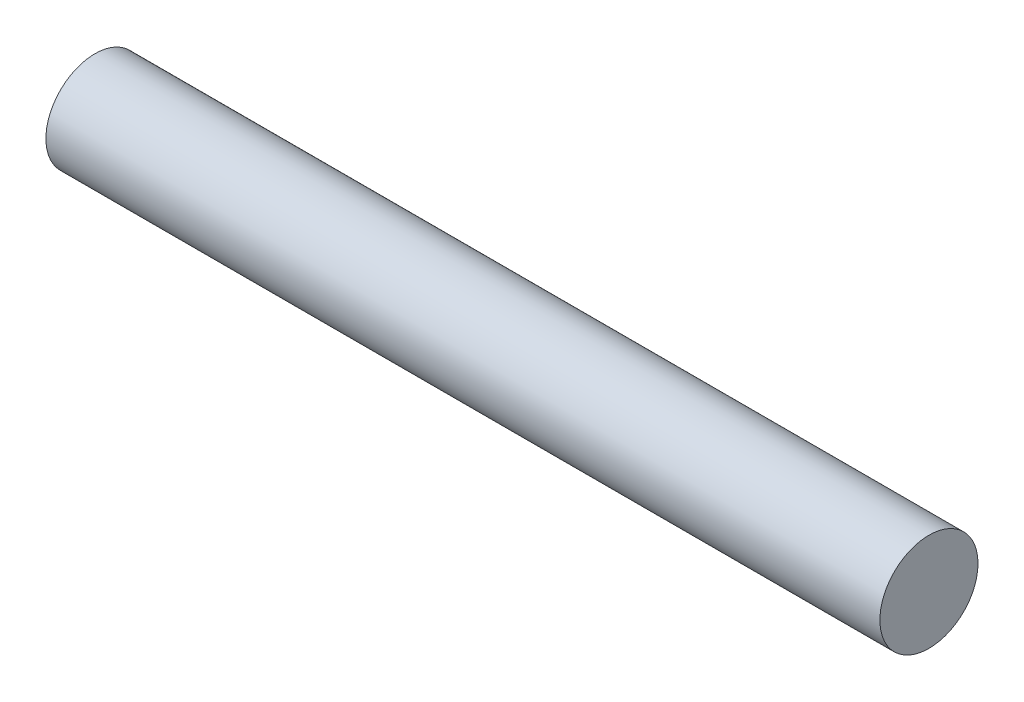
ISO-10303-21;
HEADER;
FILE_DESCRIPTION(('STEP AP214'),'2;1');
FILE_NAME('part.step','',(''),(''),'','','');
FILE_SCHEMA(('AUTOMOTIVE_DESIGN { 1 0 10303 214 1 1 1 1 }'));
ENDSEC;
DATA;
#1=APPLICATION_CONTEXT('core data for automotive mechanical design processes');
#2=APPLICATION_PROTOCOL_DEFINITION('international standard','automotive_design',2000,#1);
#3=PRODUCT_CONTEXT('',#1,'mechanical');
#4=PRODUCT('Part','Part','',(#3));
#5=PRODUCT_RELATED_PRODUCT_CATEGORY('part','',(#4));
#6=PRODUCT_DEFINITION_FORMATION('','',#4);
#7=PRODUCT_DEFINITION_CONTEXT('part definition',#1,'design');
#8=PRODUCT_DEFINITION('design','',#6,#7);
#9=PRODUCT_DEFINITION_SHAPE('','',#8);
#10=(LENGTH_UNIT() NAMED_UNIT(*) SI_UNIT(.MILLI.,.METRE.));
#11=(NAMED_UNIT(*) PLANE_ANGLE_UNIT() SI_UNIT($,.RADIAN.));
#12=(NAMED_UNIT(*) SI_UNIT($,.STERADIAN.) SOLID_ANGLE_UNIT());
#13=UNCERTAINTY_MEASURE_WITH_UNIT(LENGTH_MEASURE(1.E-05),#10,'distance_accuracy_value','');
#14=(GEOMETRIC_REPRESENTATION_CONTEXT(3) GLOBAL_UNCERTAINTY_ASSIGNED_CONTEXT((#13)) GLOBAL_UNIT_ASSIGNED_CONTEXT((#10,
#11,#12)) REPRESENTATION_CONTEXT('',''));
#15=CARTESIAN_POINT('',(0.,0.,0.));
#16=DIRECTION('',(0.,0.,1.));
#17=DIRECTION('',(1.,0.,0.));
#18=AXIS2_PLACEMENT_3D('',#15,#16,#17);
#19=CARTESIAN_POINT('',(68.,0.,0.));
#20=DIRECTION('',(-1.,0.,0.));
#21=DIRECTION('',(0.,0.,1.));
#22=AXIS2_PLACEMENT_3D('',#19,#20,#21);
#23=CYLINDRICAL_SURFACE('',#22,4.);
#24=CARTESIAN_POINT('',(68.,0.,0.));
#25=DIRECTION('',(1.,0.,0.));
#26=DIRECTION('',(0.,0.,-1.));
#27=AXIS2_PLACEMENT_3D('',#24,#25,#26);
#28=CIRCLE('',#27,4.);
#29=CARTESIAN_POINT('',(68.,0.,-4.));
#30=VERTEX_POINT('',#29);
#31=EDGE_CURVE('E10',#30,#30,#28,.T.);
#32=ORIENTED_EDGE('',*,*,#31,.F.);
#33=EDGE_LOOP('',(#32));
#34=FACE_BOUND('',#33,.T.);
#35=CARTESIAN_POINT('',(0.,0.,0.));
#36=DIRECTION('',(1.,0.,0.));
#37=DIRECTION('',(0.,0.,-1.));
#38=AXIS2_PLACEMENT_3D('',#35,#36,#37);
#39=CIRCLE('',#38,4.);
#40=CARTESIAN_POINT('',(0.,0.,-4.));
#41=VERTEX_POINT('',#40);
#42=EDGE_CURVE('E40',#41,#41,#39,.T.);
#43=ORIENTED_EDGE('',*,*,#42,.T.);
#44=EDGE_LOOP('',(#43));
#45=FACE_BOUND('',#44,.T.);
#46=ADVANCED_FACE('F37',(#34,#45),#23,.T.);
#47=CARTESIAN_POINT('',(68.,0.,0.));
#48=DIRECTION('',(1.,0.,0.));
#49=DIRECTION('',(0.,0.,-1.));
#50=AXIS2_PLACEMENT_3D('',#47,#48,#49);
#51=PLANE('',#50);
#52=ORIENTED_EDGE('',*,*,#31,.T.);
#53=EDGE_LOOP('',(#52));
#54=FACE_BOUND('',#53,.T.);
#55=ADVANCED_FACE('F52',(#54),#51,.T.);
#56=CARTESIAN_POINT('',(0.,0.,0.));
#57=DIRECTION('',(1.,0.,0.));
#58=DIRECTION('',(0.,0.,-1.));
#59=AXIS2_PLACEMENT_3D('',#56,#57,#58);
#60=PLANE('',#59);
#61=ORIENTED_EDGE('',*,*,#42,.F.);
#62=EDGE_LOOP('',(#61));
#63=FACE_BOUND('',#62,.T.);
#64=ADVANCED_FACE('F50',(#63),#60,.F.);
#65=CLOSED_SHELL('',(#46,#55,#64));
#66=MANIFOLD_SOLID_BREP('B2',#65);
#67=ADVANCED_BREP_SHAPE_REPRESENTATION('',(#18,#66),#14);
#68=SHAPE_DEFINITION_REPRESENTATION(#9,#67);
ENDSEC;
END-ISO-10303-21;
